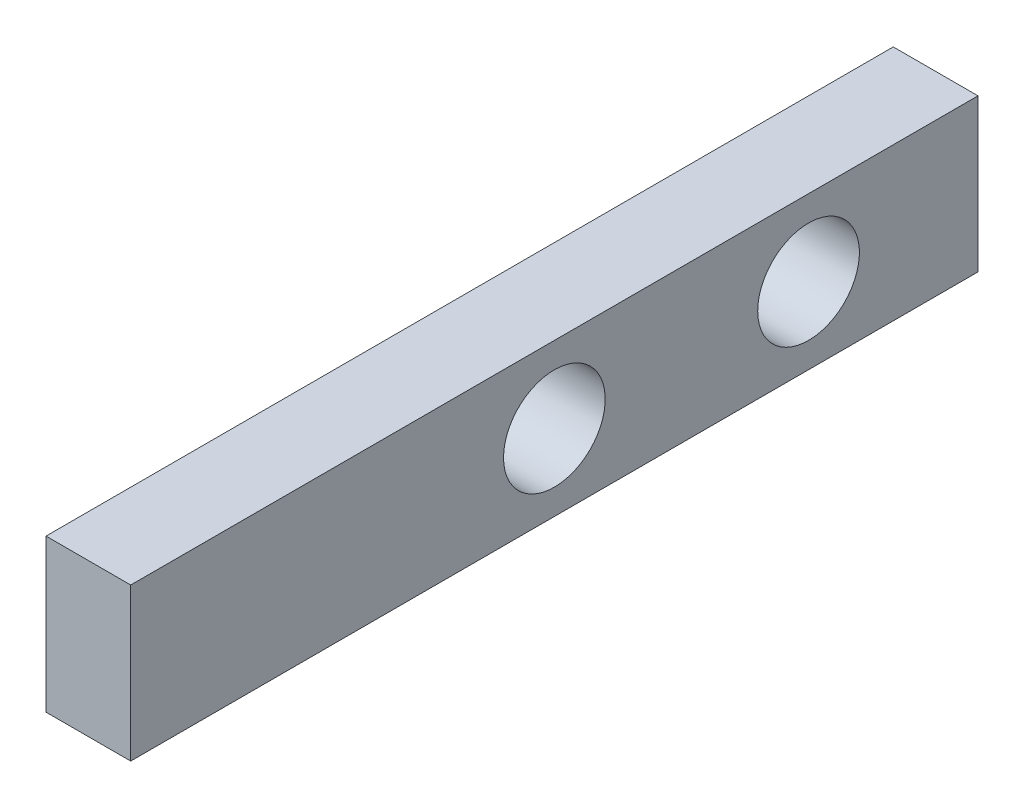
ISO-10303-21;
HEADER;
FILE_DESCRIPTION(('STEP AP214'),'2;1');
FILE_NAME('part.step','',(''),(''),'','','');
FILE_SCHEMA(('AUTOMOTIVE_DESIGN { 1 0 10303 214 1 1 1 1 }'));
ENDSEC;
DATA;
#1=APPLICATION_CONTEXT('core data for automotive mechanical design processes');
#2=APPLICATION_PROTOCOL_DEFINITION('international standard','automotive_design',2000,#1);
#3=PRODUCT_CONTEXT('',#1,'mechanical');
#4=PRODUCT('Part','Part','',(#3));
#5=PRODUCT_RELATED_PRODUCT_CATEGORY('part','',(#4));
#6=PRODUCT_DEFINITION_FORMATION('','',#4);
#7=PRODUCT_DEFINITION_CONTEXT('part definition',#1,'design');
#8=PRODUCT_DEFINITION('design','',#6,#7);
#9=PRODUCT_DEFINITION_SHAPE('','',#8);
#10=(LENGTH_UNIT() NAMED_UNIT(*) SI_UNIT(.MILLI.,.METRE.));
#11=(NAMED_UNIT(*) PLANE_ANGLE_UNIT() SI_UNIT($,.RADIAN.));
#12=(NAMED_UNIT(*) SI_UNIT($,.STERADIAN.) SOLID_ANGLE_UNIT());
#13=UNCERTAINTY_MEASURE_WITH_UNIT(LENGTH_MEASURE(1.E-05),#10,'distance_accuracy_value','');
#14=(GEOMETRIC_REPRESENTATION_CONTEXT(3) GLOBAL_UNCERTAINTY_ASSIGNED_CONTEXT((#13)) GLOBAL_UNIT_ASSIGNED_CONTEXT((#10,
#11,#12)) REPRESENTATION_CONTEXT('',''));
#15=CARTESIAN_POINT('',(0.,0.,0.));
#16=DIRECTION('',(0.,0.,1.));
#17=DIRECTION('',(1.,0.,0.));
#18=AXIS2_PLACEMENT_3D('',#15,#16,#17);
#19=CARTESIAN_POINT('',(23.708348754,-59.6,-18.));
#20=DIRECTION('',(1.,0.,0.));
#21=DIRECTION('',(0.,0.,-1.));
#22=AXIS2_PLACEMENT_3D('',#19,#20,#21);
#23=PLANE('',#22);
#24=CARTESIAN_POINT('',(23.708348754,-61.4,-28.));
#25=DIRECTION('',(1.,0.,0.));
#26=DIRECTION('',(0.,0.,-1.));
#27=AXIS2_PLACEMENT_3D('',#24,#25,#26);
#28=CIRCLE('',#27,1.2);
#29=CARTESIAN_POINT('',(23.708348754,-61.4,-29.2));
#30=VERTEX_POINT('',#29);
#31=EDGE_CURVE('E120',#30,#30,#28,.F.);
#32=ORIENTED_EDGE('',*,*,#31,.F.);
#33=EDGE_LOOP('',(#32));
#34=FACE_BOUND('',#33,.T.);
#35=CARTESIAN_POINT('',(23.708348754,-61.4,-34.));
#36=DIRECTION('',(1.,0.,0.));
#37=DIRECTION('',(0.,0.,-1.));
#38=AXIS2_PLACEMENT_3D('',#35,#36,#37);
#39=CIRCLE('',#38,1.2);
#40=CARTESIAN_POINT('',(23.708348754,-61.4,-35.2));
#41=VERTEX_POINT('',#40);
#42=EDGE_CURVE('E109',#41,#41,#39,.F.);
#43=ORIENTED_EDGE('',*,*,#42,.F.);
#44=EDGE_LOOP('',(#43));
#45=FACE_BOUND('',#44,.T.);
#46=DIRECTION('',(0.,-1.,0.));
#47=VECTOR('',#46,1.);
#48=CARTESIAN_POINT('',(23.708348754,-59.6,-38.));
#49=LINE('',#48,#47);
#50=CARTESIAN_POINT('',(23.708348754,-59.6,-38.));
#51=VERTEX_POINT('',#50);
#52=CARTESIAN_POINT('',(23.708348754,-63.2,-38.));
#53=VERTEX_POINT('',#52);
#54=EDGE_CURVE('E110',#51,#53,#49,.T.);
#55=ORIENTED_EDGE('',*,*,#54,.T.);
#56=DIRECTION('',(0.,0.,-1.));
#57=VECTOR('',#56,1.);
#58=CARTESIAN_POINT('',(23.708348754,-63.2,-18.));
#59=LINE('',#58,#57);
#60=CARTESIAN_POINT('',(23.708348754,-63.2,-18.));
#61=VERTEX_POINT('',#60);
#62=EDGE_CURVE('E11',#61,#53,#59,.T.);
#63=ORIENTED_EDGE('',*,*,#62,.F.);
#64=DIRECTION('',(0.,-1.,0.));
#65=VECTOR('',#64,1.);
#66=CARTESIAN_POINT('',(23.708348754,-59.6,-18.));
#67=LINE('',#66,#65);
#68=CARTESIAN_POINT('',(23.708348754,-59.6,-18.));
#69=VERTEX_POINT('',#68);
#70=EDGE_CURVE('E94',#69,#61,#67,.T.);
#71=ORIENTED_EDGE('',*,*,#70,.F.);
#72=DIRECTION('',(0.,0.,-1.));
#73=VECTOR('',#72,1.);
#74=CARTESIAN_POINT('',(23.708348754,-59.6,-18.));
#75=LINE('',#74,#73);
#76=EDGE_CURVE('E103',#69,#51,#75,.T.);
#77=ORIENTED_EDGE('',*,*,#76,.T.);
#78=EDGE_LOOP('',(#55,#63,#71,#77));
#79=FACE_BOUND('',#78,.T.);
#80=ADVANCED_FACE('F41',(#34,#45,#79),#23,.F.);
#81=CARTESIAN_POINT('',(23.708348754,-63.2,-18.));
#82=DIRECTION('',(0.,1.,0.));
#83=DIRECTION('',(0.,0.,1.));
#84=AXIS2_PLACEMENT_3D('',#81,#82,#83);
#85=PLANE('',#84);
#86=DIRECTION('',(1.,0.,0.));
#87=VECTOR('',#86,1.);
#88=CARTESIAN_POINT('',(23.708348754,-63.2,-38.));
#89=LINE('',#88,#87);
#90=CARTESIAN_POINT('',(25.708348754,-63.2,-38.));
#91=VERTEX_POINT('',#90);
#92=EDGE_CURVE('E98',#53,#91,#89,.T.);
#93=ORIENTED_EDGE('',*,*,#92,.T.);
#94=DIRECTION('',(0.,0.,-1.));
#95=VECTOR('',#94,1.);
#96=CARTESIAN_POINT('',(25.708348754,-63.2,-18.));
#97=LINE('',#96,#95);
#98=CARTESIAN_POINT('',(25.708348754,-63.2,-18.));
#99=VERTEX_POINT('',#98);
#100=EDGE_CURVE('E49',#99,#91,#97,.T.);
#101=ORIENTED_EDGE('',*,*,#100,.F.);
#102=DIRECTION('',(1.,0.,0.));
#103=VECTOR('',#102,1.);
#104=CARTESIAN_POINT('',(23.708348754,-63.2,-18.));
#105=LINE('',#104,#103);
#106=EDGE_CURVE('E90',#61,#99,#105,.T.);
#107=ORIENTED_EDGE('',*,*,#106,.F.);
#108=ORIENTED_EDGE('',*,*,#62,.T.);
#109=EDGE_LOOP('',(#93,#101,#107,#108));
#110=FACE_BOUND('',#109,.T.);
#111=ADVANCED_FACE('F100',(#110),#85,.F.);
#112=CARTESIAN_POINT('',(25.708348754,-63.2,-18.));
#113=DIRECTION('',(-1.,0.,0.));
#114=DIRECTION('',(0.,0.,1.));
#115=AXIS2_PLACEMENT_3D('',#112,#113,#114);
#116=PLANE('',#115);
#117=CARTESIAN_POINT('',(25.708348754,-61.4,-28.));
#118=DIRECTION('',(-1.,0.,0.));
#119=DIRECTION('',(0.,0.,1.));
#120=AXIS2_PLACEMENT_3D('',#117,#118,#119);
#121=CIRCLE('',#120,1.2);
#122=CARTESIAN_POINT('',(25.708348754,-61.4,-26.8));
#123=VERTEX_POINT('',#122);
#124=EDGE_CURVE('E42',#123,#123,#121,.F.);
#125=ORIENTED_EDGE('',*,*,#124,.F.);
#126=EDGE_LOOP('',(#125));
#127=FACE_BOUND('',#126,.T.);
#128=CARTESIAN_POINT('',(25.708348754,-61.4,-34.));
#129=DIRECTION('',(-1.,0.,0.));
#130=DIRECTION('',(0.,0.,1.));
#131=AXIS2_PLACEMENT_3D('',#128,#129,#130);
#132=CIRCLE('',#131,1.2);
#133=CARTESIAN_POINT('',(25.708348754,-61.4,-32.8));
#134=VERTEX_POINT('',#133);
#135=EDGE_CURVE('E113',#134,#134,#132,.F.);
#136=ORIENTED_EDGE('',*,*,#135,.F.);
#137=EDGE_LOOP('',(#136));
#138=FACE_BOUND('',#137,.T.);
#139=DIRECTION('',(0.,1.,0.));
#140=VECTOR('',#139,1.);
#141=CARTESIAN_POINT('',(25.708348754,-63.2,-38.));
#142=LINE('',#141,#140);
#143=CARTESIAN_POINT('',(25.708348754,-59.6,-38.));
#144=VERTEX_POINT('',#143);
#145=EDGE_CURVE('E78',#91,#144,#142,.T.);
#146=ORIENTED_EDGE('',*,*,#145,.T.);
#147=DIRECTION('',(0.,0.,-1.));
#148=VECTOR('',#147,1.);
#149=CARTESIAN_POINT('',(25.708348754,-59.6,-18.));
#150=LINE('',#149,#148);
#151=CARTESIAN_POINT('',(25.708348754,-59.6,-18.));
#152=VERTEX_POINT('',#151);
#153=EDGE_CURVE('E97',#152,#144,#150,.T.);
#154=ORIENTED_EDGE('',*,*,#153,.F.);
#155=DIRECTION('',(0.,1.,0.));
#156=VECTOR('',#155,1.);
#157=CARTESIAN_POINT('',(25.708348754,-63.2,-18.));
#158=LINE('',#157,#156);
#159=EDGE_CURVE('E95',#99,#152,#158,.T.);
#160=ORIENTED_EDGE('',*,*,#159,.F.);
#161=ORIENTED_EDGE('',*,*,#100,.T.);
#162=EDGE_LOOP('',(#146,#154,#160,#161));
#163=FACE_BOUND('',#162,.T.);
#164=ADVANCED_FACE('F101',(#127,#138,#163),#116,.F.);
#165=CARTESIAN_POINT('',(25.708348754,-59.6,-18.));
#166=DIRECTION('',(0.,-1.,0.));
#167=DIRECTION('',(0.,0.,-1.));
#168=AXIS2_PLACEMENT_3D('',#165,#166,#167);
#169=PLANE('',#168);
#170=DIRECTION('',(-1.,0.,0.));
#171=VECTOR('',#170,1.);
#172=CARTESIAN_POINT('',(25.708348754,-59.6,-38.));
#173=LINE('',#172,#171);
#174=EDGE_CURVE('E85',#144,#51,#173,.T.);
#175=ORIENTED_EDGE('',*,*,#174,.T.);
#176=ORIENTED_EDGE('',*,*,#76,.F.);
#177=DIRECTION('',(-1.,0.,0.));
#178=VECTOR('',#177,1.);
#179=CARTESIAN_POINT('',(25.708348754,-59.6,-18.));
#180=LINE('',#179,#178);
#181=EDGE_CURVE('E56',#152,#69,#180,.T.);
#182=ORIENTED_EDGE('',*,*,#181,.F.);
#183=ORIENTED_EDGE('',*,*,#153,.T.);
#184=EDGE_LOOP('',(#175,#176,#182,#183));
#185=FACE_BOUND('',#184,.T.);
#186=ADVANCED_FACE('F131',(#185),#169,.F.);
#187=CARTESIAN_POINT('',(0.,0.,-18.));
#188=DIRECTION('',(0.,0.,1.));
#189=DIRECTION('',(1.,0.,0.));
#190=AXIS2_PLACEMENT_3D('',#187,#188,#189);
#191=PLANE('',#190);
#192=ORIENTED_EDGE('',*,*,#70,.T.);
#193=ORIENTED_EDGE('',*,*,#106,.T.);
#194=ORIENTED_EDGE('',*,*,#159,.T.);
#195=ORIENTED_EDGE('',*,*,#181,.T.);
#196=EDGE_LOOP('',(#192,#193,#194,#195));
#197=FACE_BOUND('',#196,.T.);
#198=ADVANCED_FACE('F89',(#197),#191,.T.);
#199=CARTESIAN_POINT('',(0.,0.,-38.));
#200=DIRECTION('',(0.,0.,1.));
#201=DIRECTION('',(1.,0.,0.));
#202=AXIS2_PLACEMENT_3D('',#199,#200,#201);
#203=PLANE('',#202);
#204=ORIENTED_EDGE('',*,*,#54,.F.);
#205=ORIENTED_EDGE('',*,*,#174,.F.);
#206=ORIENTED_EDGE('',*,*,#145,.F.);
#207=ORIENTED_EDGE('',*,*,#92,.F.);
#208=EDGE_LOOP('',(#204,#205,#206,#207));
#209=FACE_BOUND('',#208,.T.);
#210=ADVANCED_FACE('F151',(#209),#203,.F.);
#211=CARTESIAN_POINT('',(25.808348754,-61.4,-34.));
#212=DIRECTION('',(-1.,0.,0.));
#213=DIRECTION('',(0.,0.,1.));
#214=AXIS2_PLACEMENT_3D('',#211,#212,#213);
#215=CYLINDRICAL_SURFACE('',#214,1.2);
#216=ORIENTED_EDGE('',*,*,#135,.T.);
#217=EDGE_LOOP('',(#216));
#218=FACE_BOUND('',#217,.T.);
#219=ORIENTED_EDGE('',*,*,#42,.T.);
#220=EDGE_LOOP('',(#219));
#221=FACE_BOUND('',#220,.T.);
#222=ADVANCED_FACE('F153',(#218,#221),#215,.F.);
#223=CARTESIAN_POINT('',(25.808348754,-61.4,-28.));
#224=DIRECTION('',(-1.,0.,0.));
#225=DIRECTION('',(0.,0.,1.));
#226=AXIS2_PLACEMENT_3D('',#223,#224,#225);
#227=CYLINDRICAL_SURFACE('',#226,1.2);
#228=ORIENTED_EDGE('',*,*,#124,.T.);
#229=EDGE_LOOP('',(#228));
#230=FACE_BOUND('',#229,.T.);
#231=ORIENTED_EDGE('',*,*,#31,.T.);
#232=EDGE_LOOP('',(#231));
#233=FACE_BOUND('',#232,.T.);
#234=ADVANCED_FACE('F129',(#230,#233),#227,.F.);
#235=CLOSED_SHELL('',(#80,#111,#164,#186,#198,#210,#222,#234));
#236=MANIFOLD_SOLID_BREP('B2',#235);
#237=ADVANCED_BREP_SHAPE_REPRESENTATION('',(#18,#236),#14);
#238=SHAPE_DEFINITION_REPRESENTATION(#9,#237);
ENDSEC;
END-ISO-10303-21;
